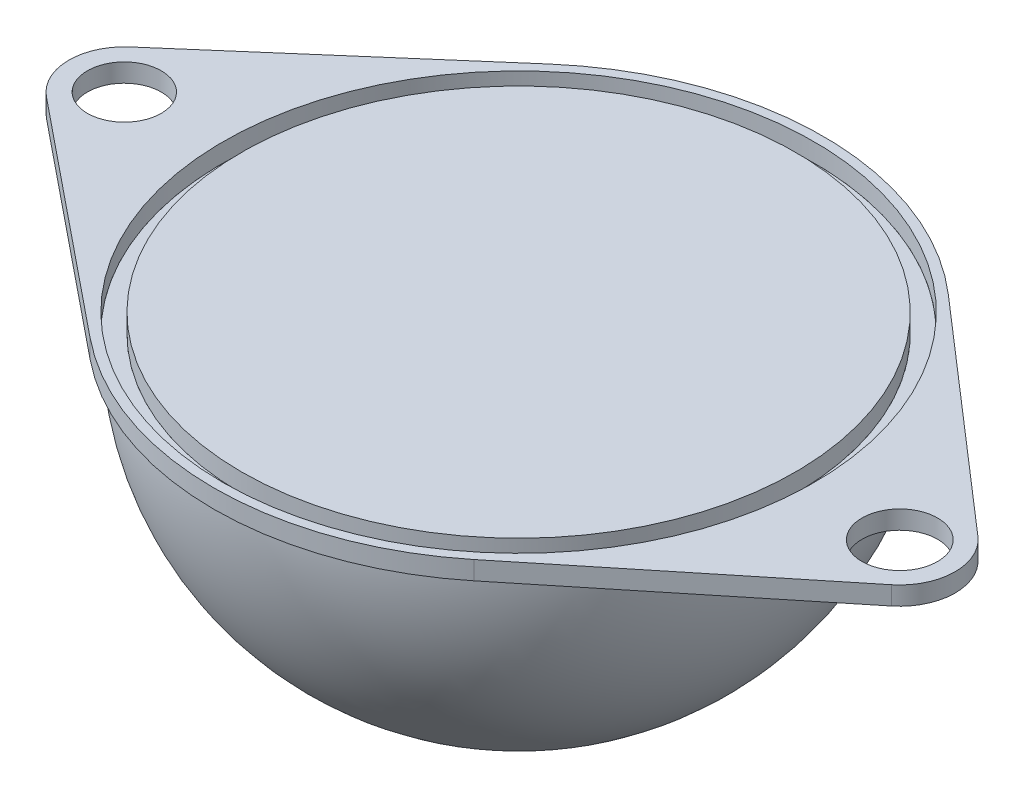
ISO-10303-21;
HEADER;
FILE_DESCRIPTION(('STEP AP214'),'2;1');
FILE_NAME('part.step','',(''),(''),'','','');
FILE_SCHEMA(('AUTOMOTIVE_DESIGN { 1 0 10303 214 1 1 1 1 }'));
ENDSEC;
DATA;
#1=APPLICATION_CONTEXT('core data for automotive mechanical design processes');
#2=APPLICATION_PROTOCOL_DEFINITION('international standard','automotive_design',2000,#1);
#3=PRODUCT_CONTEXT('',#1,'mechanical');
#4=PRODUCT('Part','Part','',(#3));
#5=PRODUCT_RELATED_PRODUCT_CATEGORY('part','',(#4));
#6=PRODUCT_DEFINITION_FORMATION('','',#4);
#7=PRODUCT_DEFINITION_CONTEXT('part definition',#1,'design');
#8=PRODUCT_DEFINITION('design','',#6,#7);
#9=PRODUCT_DEFINITION_SHAPE('','',#8);
#10=(LENGTH_UNIT() NAMED_UNIT(*) SI_UNIT(.MILLI.,.METRE.));
#11=(NAMED_UNIT(*) PLANE_ANGLE_UNIT() SI_UNIT($,.RADIAN.));
#12=(NAMED_UNIT(*) SI_UNIT($,.STERADIAN.) SOLID_ANGLE_UNIT());
#13=UNCERTAINTY_MEASURE_WITH_UNIT(LENGTH_MEASURE(1.E-05),#10,'distance_accuracy_value','');
#14=(GEOMETRIC_REPRESENTATION_CONTEXT(3) GLOBAL_UNCERTAINTY_ASSIGNED_CONTEXT((#13)) GLOBAL_UNIT_ASSIGNED_CONTEXT((#10,
#11,#12)) REPRESENTATION_CONTEXT('',''));
#15=CARTESIAN_POINT('',(0.,0.,0.));
#16=DIRECTION('',(0.,0.,1.));
#17=DIRECTION('',(1.,0.,0.));
#18=AXIS2_PLACEMENT_3D('',#15,#16,#17);
#19=CARTESIAN_POINT('',(0.,1.,0.));
#20=DIRECTION('',(0.,-1.,0.));
#21=DIRECTION('',(0.,0.,-1.));
#22=AXIS2_PLACEMENT_3D('',#19,#20,#21);
#23=CYLINDRICAL_SURFACE('',#22,15.);
#24=CARTESIAN_POINT('',(0.,1.,0.));
#25=DIRECTION('',(0.,1.,0.));
#26=DIRECTION('',(0.,0.,1.));
#27=AXIS2_PLACEMENT_3D('',#24,#25,#26);
#28=CIRCLE('',#27,15.);
#29=CARTESIAN_POINT('',(0.,1.,15.));
#30=VERTEX_POINT('',#29);
#31=EDGE_CURVE('E12',#30,#30,#28,.T.);
#32=ORIENTED_EDGE('',*,*,#31,.F.);
#33=EDGE_LOOP('',(#32));
#34=FACE_BOUND('',#33,.T.);
#35=CARTESIAN_POINT('',(0.,0.,0.));
#36=DIRECTION('',(0.,1.,0.));
#37=DIRECTION('',(0.,0.,1.));
#38=AXIS2_PLACEMENT_3D('',#35,#36,#37);
#39=CIRCLE('',#38,15.);
#40=CARTESIAN_POINT('',(0.,0.,15.));
#41=VERTEX_POINT('',#40);
#42=EDGE_CURVE('E86',#41,#41,#39,.T.);
#43=ORIENTED_EDGE('',*,*,#42,.T.);
#44=EDGE_LOOP('',(#43));
#45=FACE_BOUND('',#44,.T.);
#46=ADVANCED_FACE('F83',(#34,#45),#23,.T.);
#47=CARTESIAN_POINT('',(0.,1.,0.));
#48=DIRECTION('',(0.,1.,0.));
#49=DIRECTION('',(0.,0.,1.));
#50=AXIS2_PLACEMENT_3D('',#47,#48,#49);
#51=PLANE('',#50);
#52=ORIENTED_EDGE('',*,*,#31,.T.);
#53=EDGE_LOOP('',(#52));
#54=FACE_BOUND('',#53,.T.);
#55=ADVANCED_FACE('F98',(#54),#51,.T.);
#56=CARTESIAN_POINT('',(0.,0.,0.));
#57=DIRECTION('',(0.,1.,0.));
#58=DIRECTION('',(0.,0.,1.));
#59=AXIS2_PLACEMENT_3D('',#56,#57,#58);
#60=PLANE('',#59);
#61=ORIENTED_EDGE('',*,*,#42,.F.);
#62=EDGE_LOOP('',(#61));
#63=FACE_BOUND('',#62,.T.);
#64=ADVANCED_FACE('F96',(#63),#60,.F.);
#65=CLOSED_SHELL('',(#46,#55,#64));
#66=MANIFOLD_SOLID_BREP('B2',#65);
#67=CARTESIAN_POINT('',(10.3909072758781,1.,12.8171387596493));
#68=DIRECTION('',(0.629751956113825,0.,0.776796288463591));
#69=DIRECTION('',(0.776796288463591,0.,-0.629751956113825));
#70=AXIS2_PLACEMENT_3D('',#67,#68,#69);
#71=PLANE('',#70);
#72=DIRECTION('',(-0.776796288463591,0.,0.629751956113825));
#73=VECTOR('',#72,1.);
#74=CARTESIAN_POINT('',(10.3909072758781,0.,12.8171387596493));
#75=LINE('',#74,#73);
#76=CARTESIAN_POINT('',(22.8895238825921,0.,2.68445870737627));
#77=VERTEX_POINT('',#76);
#78=CARTESIAN_POINT('',(10.3909072758781,0.,12.8171387596493));
#79=VERTEX_POINT('',#78);
#80=EDGE_CURVE('E266',#77,#79,#75,.T.);
#81=ORIENTED_EDGE('',*,*,#80,.F.);
#82=DIRECTION('',(0.,-1.,0.));
#83=VECTOR('',#82,1.);
#84=CARTESIAN_POINT('',(22.8895238825921,1.,2.68445870737627));
#85=LINE('',#84,#83);
#86=CARTESIAN_POINT('',(22.8895238825921,1.,2.68445870737627));
#87=VERTEX_POINT('',#86);
#88=EDGE_CURVE('E81',#87,#77,#85,.T.);
#89=ORIENTED_EDGE('',*,*,#88,.F.);
#90=DIRECTION('',(-0.776796288463591,0.,0.629751956113825));
#91=VECTOR('',#90,1.);
#92=CARTESIAN_POINT('',(10.3909072758781,1.,12.8171387596493));
#93=LINE('',#92,#91);
#94=CARTESIAN_POINT('',(10.3909072758781,1.,12.8171387596493));
#95=VERTEX_POINT('',#94);
#96=EDGE_CURVE('E343',#87,#95,#93,.T.);
#97=ORIENTED_EDGE('',*,*,#96,.T.);
#98=DIRECTION('',(0.,-1.,0.));
#99=VECTOR('',#98,1.);
#100=CARTESIAN_POINT('',(10.3909072758781,1.,12.8171387596493));
#101=LINE('',#100,#99);
#102=EDGE_CURVE('E194',#95,#79,#101,.T.);
#103=ORIENTED_EDGE('',*,*,#102,.T.);
#104=EDGE_LOOP('',(#81,#89,#97,#103));
#105=FACE_BOUND('',#104,.T.);
#106=ADVANCED_FACE('F143',(#105),#71,.T.);
#107=CARTESIAN_POINT('',(21.,1.,0.353739247577881));
#108=DIRECTION('',(0.,-1.,0.));
#109=DIRECTION('',(0.,0.,-1.));
#110=AXIS2_PLACEMENT_3D('',#107,#108,#109);
#111=CYLINDRICAL_SURFACE('',#110,3.00042558700744);
#112=CARTESIAN_POINT('',(21.,0.,0.353739247577881));
#113=DIRECTION('',(0.,1.,0.));
#114=DIRECTION('',(0.,0.,1.));
#115=AXIS2_PLACEMENT_3D('',#112,#113,#114);
#116=CIRCLE('',#115,3.00042558700744);
#117=CARTESIAN_POINT('',(22.966950289829,0.,-1.91201896117064));
#118=VERTEX_POINT('',#117);
#119=EDGE_CURVE('E260',#118,#77,#116,.F.);
#120=ORIENTED_EDGE('',*,*,#119,.F.);
#121=DIRECTION('',(0.,-1.,0.));
#122=VECTOR('',#121,1.);
#123=CARTESIAN_POINT('',(22.966950289829,1.,-1.91201896117064));
#124=LINE('',#123,#122);
#125=CARTESIAN_POINT('',(22.966950289829,1.,-1.91201896117064));
#126=VERTEX_POINT('',#125);
#127=EDGE_CURVE('E152',#126,#118,#124,.T.);
#128=ORIENTED_EDGE('',*,*,#127,.F.);
#129=CARTESIAN_POINT('',(21.,1.,0.353739247577881));
#130=DIRECTION('',(0.,1.,0.));
#131=DIRECTION('',(0.,0.,1.));
#132=AXIS2_PLACEMENT_3D('',#129,#130,#131);
#133=CIRCLE('',#132,3.00042558700744);
#134=EDGE_CURVE('E345',#126,#87,#133,.F.);
#135=ORIENTED_EDGE('',*,*,#134,.T.);
#136=ORIENTED_EDGE('',*,*,#88,.T.);
#137=EDGE_LOOP('',(#120,#128,#135,#136));
#138=FACE_BOUND('',#137,.T.);
#139=ADVANCED_FACE('F265',(#138),#111,.T.);
#140=CARTESIAN_POINT('',(10.8166921128507,1.,-12.4599025572351));
#141=DIRECTION('',(-0.655557097748529,0.,0.755145609529398));
#142=DIRECTION('',(0.755145609529398,0.,0.655557097748529));
#143=AXIS2_PLACEMENT_3D('',#140,#141,#142);
#144=PLANE('',#143);
#145=DIRECTION('',(-0.755145609529398,0.,-0.655557097748529));
#146=VECTOR('',#145,1.);
#147=CARTESIAN_POINT('',(10.8166921128507,0.,-12.4599025572351));
#148=LINE('',#147,#146);
#149=CARTESIAN_POINT('',(10.8166921128507,0.,-12.4599025572351));
#150=VERTEX_POINT('',#149);
#151=EDGE_CURVE('E250',#118,#150,#148,.T.);
#152=ORIENTED_EDGE('',*,*,#151,.T.);
#153=DIRECTION('',(0.,-1.,0.));
#154=VECTOR('',#153,1.);
#155=CARTESIAN_POINT('',(10.8166921128507,1.,-12.4599025572351));
#156=LINE('',#155,#154);
#157=CARTESIAN_POINT('',(10.8166921128507,1.,-12.4599025572351));
#158=VERTEX_POINT('',#157);
#159=EDGE_CURVE('E242',#158,#150,#156,.T.);
#160=ORIENTED_EDGE('',*,*,#159,.F.);
#161=DIRECTION('',(-0.755145609529398,0.,-0.655557097748529));
#162=VECTOR('',#161,1.);
#163=CARTESIAN_POINT('',(10.8166921128507,1.,-12.4599025572351));
#164=LINE('',#163,#162);
#165=EDGE_CURVE('E252',#126,#158,#164,.T.);
#166=ORIENTED_EDGE('',*,*,#165,.F.);
#167=ORIENTED_EDGE('',*,*,#127,.T.);
#168=EDGE_LOOP('',(#152,#160,#166,#167));
#169=FACE_BOUND('',#168,.T.);
#170=ADVANCED_FACE('F248',(#169),#144,.F.);
#171=CARTESIAN_POINT('',(0.,1.,0.));
#172=DIRECTION('',(0.,-1.,0.));
#173=DIRECTION('',(0.,0.,-1.));
#174=AXIS2_PLACEMENT_3D('',#171,#172,#173);
#175=CYLINDRICAL_SURFACE('',#174,16.5);
#176=CARTESIAN_POINT('',(0.,0.,0.));
#177=DIRECTION('',(0.,1.,0.));
#178=DIRECTION('',(0.,0.,1.));
#179=AXIS2_PLACEMENT_3D('',#176,#177,#178);
#180=CIRCLE('',#179,16.5);
#181=CARTESIAN_POINT('',(-10.8166921128507,0.,-12.4599025572349));
#182=VERTEX_POINT('',#181);
#183=EDGE_CURVE('E263',#150,#182,#180,.T.);
#184=ORIENTED_EDGE('',*,*,#183,.T.);
#185=DIRECTION('',(0.,-1.,0.));
#186=VECTOR('',#185,1.);
#187=CARTESIAN_POINT('',(-10.8166921128507,1.,-12.4599025572349));
#188=LINE('',#187,#186);
#189=CARTESIAN_POINT('',(-10.8166921128507,1.,-12.4599025572349));
#190=VERTEX_POINT('',#189);
#191=EDGE_CURVE('E236',#190,#182,#188,.T.);
#192=ORIENTED_EDGE('',*,*,#191,.F.);
#193=CARTESIAN_POINT('',(0.,1.,0.));
#194=DIRECTION('',(0.,1.,0.));
#195=DIRECTION('',(0.,0.,1.));
#196=AXIS2_PLACEMENT_3D('',#193,#194,#195);
#197=CIRCLE('',#196,16.5);
#198=EDGE_CURVE('E351',#158,#190,#197,.T.);
#199=ORIENTED_EDGE('',*,*,#198,.F.);
#200=ORIENTED_EDGE('',*,*,#159,.T.);
#201=EDGE_LOOP('',(#184,#192,#199,#200));
#202=FACE_BOUND('',#201,.T.);
#203=ADVANCED_FACE('F317',(#202),#175,.T.);
#204=CARTESIAN_POINT('',(-10.8166921128507,1.,-12.4599025572349));
#205=DIRECTION('',(-0.655557097748529,0.,-0.755145609529398));
#206=DIRECTION('',(-0.755145609529398,0.,0.655557097748529));
#207=AXIS2_PLACEMENT_3D('',#204,#205,#206);
#208=PLANE('',#207);
#209=DIRECTION('',(0.755145609529398,0.,-0.655557097748529));
#210=VECTOR('',#209,1.);
#211=CARTESIAN_POINT('',(-10.8166921128507,0.,-12.4599025572349));
#212=LINE('',#211,#210);
#213=CARTESIAN_POINT('',(-22.966950289829,0.,-1.91201896117045));
#214=VERTEX_POINT('',#213);
#215=EDGE_CURVE('E273',#214,#182,#212,.T.);
#216=ORIENTED_EDGE('',*,*,#215,.F.);
#217=DIRECTION('',(0.,-1.,0.));
#218=VECTOR('',#217,1.);
#219=CARTESIAN_POINT('',(-22.966950289829,1.,-1.91201896117045));
#220=LINE('',#219,#218);
#221=CARTESIAN_POINT('',(-22.966950289829,1.,-1.91201896117045));
#222=VERTEX_POINT('',#221);
#223=EDGE_CURVE('E234',#222,#214,#220,.T.);
#224=ORIENTED_EDGE('',*,*,#223,.F.);
#225=DIRECTION('',(0.755145609529398,0.,-0.655557097748529));
#226=VECTOR('',#225,1.);
#227=CARTESIAN_POINT('',(-10.8166921128507,1.,-12.4599025572349));
#228=LINE('',#227,#226);
#229=EDGE_CURVE('E228',#222,#190,#228,.T.);
#230=ORIENTED_EDGE('',*,*,#229,.T.);
#231=ORIENTED_EDGE('',*,*,#191,.T.);
#232=EDGE_LOOP('',(#216,#224,#230,#231));
#233=FACE_BOUND('',#232,.T.);
#234=ADVANCED_FACE('F320',(#233),#208,.T.);
#235=CARTESIAN_POINT('',(-21.,1.,0.3537392475777));
#236=DIRECTION('',(0.,-1.,0.));
#237=DIRECTION('',(0.,0.,-1.));
#238=AXIS2_PLACEMENT_3D('',#235,#236,#237);
#239=CYLINDRICAL_SURFACE('',#238,3.00042558700744);
#240=CARTESIAN_POINT('',(-21.,0.,0.3537392475777));
#241=DIRECTION('',(0.,1.,0.));
#242=DIRECTION('',(0.,0.,1.));
#243=AXIS2_PLACEMENT_3D('',#240,#241,#242);
#244=CIRCLE('',#243,3.00042558700744);
#245=CARTESIAN_POINT('',(-22.8895238825917,0.,2.68445870737646));
#246=VERTEX_POINT('',#245);
#247=EDGE_CURVE('E233',#214,#246,#244,.T.);
#248=ORIENTED_EDGE('',*,*,#247,.T.);
#249=DIRECTION('',(0.,-1.,0.));
#250=VECTOR('',#249,1.);
#251=CARTESIAN_POINT('',(-22.8895238825917,1.,2.68445870737646));
#252=LINE('',#251,#250);
#253=CARTESIAN_POINT('',(-22.8895238825917,1.,2.68445870737646));
#254=VERTEX_POINT('',#253);
#255=EDGE_CURVE('E218',#254,#246,#252,.T.);
#256=ORIENTED_EDGE('',*,*,#255,.F.);
#257=CARTESIAN_POINT('',(-21.,1.,0.3537392475777));
#258=DIRECTION('',(0.,1.,0.));
#259=DIRECTION('',(0.,0.,1.));
#260=AXIS2_PLACEMENT_3D('',#257,#258,#259);
#261=CIRCLE('',#260,3.00042558700744);
#262=EDGE_CURVE('E221',#222,#254,#261,.T.);
#263=ORIENTED_EDGE('',*,*,#262,.F.);
#264=ORIENTED_EDGE('',*,*,#223,.T.);
#265=EDGE_LOOP('',(#248,#256,#263,#264));
#266=FACE_BOUND('',#265,.T.);
#267=ADVANCED_FACE('F231',(#266),#239,.T.);
#268=CARTESIAN_POINT('',(-10.3909072758781,1.,12.8171387596495));
#269=DIRECTION('',(0.629751956113825,0.,-0.776796288463591));
#270=DIRECTION('',(-0.776796288463591,0.,-0.629751956113825));
#271=AXIS2_PLACEMENT_3D('',#268,#269,#270);
#272=PLANE('',#271);
#273=DIRECTION('',(0.776796288463591,0.,0.629751956113825));
#274=VECTOR('',#273,1.);
#275=CARTESIAN_POINT('',(-10.3909072758781,0.,12.8171387596495));
#276=LINE('',#275,#274);
#277=CARTESIAN_POINT('',(-10.3909072758781,0.,12.8171387596495));
#278=VERTEX_POINT('',#277);
#279=EDGE_CURVE('E276',#246,#278,#276,.T.);
#280=ORIENTED_EDGE('',*,*,#279,.T.);
#281=DIRECTION('',(0.,-1.,0.));
#282=VECTOR('',#281,1.);
#283=CARTESIAN_POINT('',(-10.3909072758781,1.,12.8171387596495));
#284=LINE('',#283,#282);
#285=CARTESIAN_POINT('',(-10.3909072758781,1.,12.8171387596495));
#286=VERTEX_POINT('',#285);
#287=EDGE_CURVE('E220',#286,#278,#284,.T.);
#288=ORIENTED_EDGE('',*,*,#287,.F.);
#289=DIRECTION('',(0.776796288463591,0.,0.629751956113825));
#290=VECTOR('',#289,1.);
#291=CARTESIAN_POINT('',(-10.3909072758781,1.,12.8171387596495));
#292=LINE('',#291,#290);
#293=EDGE_CURVE('E213',#254,#286,#292,.T.);
#294=ORIENTED_EDGE('',*,*,#293,.F.);
#295=ORIENTED_EDGE('',*,*,#255,.T.);
#296=EDGE_LOOP('',(#280,#288,#294,#295));
#297=FACE_BOUND('',#296,.T.);
#298=ADVANCED_FACE('F216',(#297),#272,.F.);
#299=CARTESIAN_POINT('',(0.,1.,0.));
#300=DIRECTION('',(0.,-1.,0.));
#301=DIRECTION('',(0.,0.,-1.));
#302=AXIS2_PLACEMENT_3D('',#299,#300,#301);
#303=CYLINDRICAL_SURFACE('',#302,16.5);
#304=CARTESIAN_POINT('',(0.,0.,0.));
#305=DIRECTION('',(0.,1.,0.));
#306=DIRECTION('',(0.,0.,1.));
#307=AXIS2_PLACEMENT_3D('',#304,#305,#306);
#308=CIRCLE('',#307,16.5);
#309=EDGE_CURVE('E187',#278,#79,#308,.T.);
#310=ORIENTED_EDGE('',*,*,#309,.T.);
#311=ORIENTED_EDGE('',*,*,#102,.F.);
#312=CARTESIAN_POINT('',(0.,1.,0.));
#313=DIRECTION('',(0.,1.,0.));
#314=DIRECTION('',(0.,0.,1.));
#315=AXIS2_PLACEMENT_3D('',#312,#313,#314);
#316=CIRCLE('',#315,16.5);
#317=EDGE_CURVE('E160',#286,#95,#316,.T.);
#318=ORIENTED_EDGE('',*,*,#317,.F.);
#319=ORIENTED_EDGE('',*,*,#287,.T.);
#320=EDGE_LOOP('',(#310,#311,#318,#319));
#321=FACE_BOUND('',#320,.T.);
#322=ADVANCED_FACE('F297',(#321),#303,.T.);
#323=CARTESIAN_POINT('',(21.,1.,0.353739247577881));
#324=DIRECTION('',(0.,-1.,0.));
#325=DIRECTION('',(0.,0.,-1.));
#326=AXIS2_PLACEMENT_3D('',#323,#324,#325);
#327=CYLINDRICAL_SURFACE('',#326,2.04612011291577);
#328=CARTESIAN_POINT('',(21.,1.,0.353739247577881));
#329=DIRECTION('',(0.,1.,0.));
#330=DIRECTION('',(0.,0.,1.));
#331=AXIS2_PLACEMENT_3D('',#328,#329,#330);
#332=CIRCLE('',#331,2.04612011291577);
#333=CARTESIAN_POINT('',(21.,1.,2.39985936049365));
#334=VERTEX_POINT('',#333);
#335=EDGE_CURVE('E342',#334,#334,#332,.T.);
#336=ORIENTED_EDGE('',*,*,#335,.T.);
#337=EDGE_LOOP('',(#336));
#338=FACE_BOUND('',#337,.T.);
#339=CARTESIAN_POINT('',(21.,0.,0.353739247577881));
#340=DIRECTION('',(0.,1.,0.));
#341=DIRECTION('',(0.,0.,1.));
#342=AXIS2_PLACEMENT_3D('',#339,#340,#341);
#343=CIRCLE('',#342,2.04612011291577);
#344=CARTESIAN_POINT('',(21.,0.,2.39985936049365));
#345=VERTEX_POINT('',#344);
#346=EDGE_CURVE('E268',#345,#345,#343,.T.);
#347=ORIENTED_EDGE('',*,*,#346,.F.);
#348=EDGE_LOOP('',(#347));
#349=FACE_BOUND('',#348,.T.);
#350=ADVANCED_FACE('F295',(#338,#349),#327,.F.);
#351=CARTESIAN_POINT('',(0.,1.,0.));
#352=DIRECTION('',(0.,-1.,0.));
#353=DIRECTION('',(0.,0.,-1.));
#354=AXIS2_PLACEMENT_3D('',#351,#352,#353);
#355=CYLINDRICAL_SURFACE('',#354,16.);
#356=CARTESIAN_POINT('',(0.,1.,0.));
#357=DIRECTION('',(0.,1.,0.));
#358=DIRECTION('',(0.,0.,1.));
#359=AXIS2_PLACEMENT_3D('',#356,#357,#358);
#360=CIRCLE('',#359,16.);
#361=CARTESIAN_POINT('',(0.,1.,16.));
#362=VERTEX_POINT('',#361);
#363=EDGE_CURVE('E281',#362,#362,#360,.T.);
#364=ORIENTED_EDGE('',*,*,#363,.T.);
#365=EDGE_LOOP('',(#364));
#366=FACE_BOUND('',#365,.T.);
#367=CARTESIAN_POINT('',(0.,0.,0.));
#368=DIRECTION('',(0.,1.,0.));
#369=DIRECTION('',(0.,0.,1.));
#370=AXIS2_PLACEMENT_3D('',#367,#368,#369);
#371=CIRCLE('',#370,16.);
#372=CARTESIAN_POINT('',(0.,0.,16.));
#373=VERTEX_POINT('',#372);
#374=EDGE_CURVE('E289',#373,#373,#371,.T.);
#375=ORIENTED_EDGE('',*,*,#374,.F.);
#376=EDGE_LOOP('',(#375));
#377=FACE_BOUND('',#376,.T.);
#378=ADVANCED_FACE('F145',(#366,#377),#355,.F.);
#379=CARTESIAN_POINT('',(-21.,1.,0.3537392475777));
#380=DIRECTION('',(0.,-1.,0.));
#381=DIRECTION('',(0.,0.,-1.));
#382=AXIS2_PLACEMENT_3D('',#379,#380,#381);
#383=CYLINDRICAL_SURFACE('',#382,2.);
#384=CARTESIAN_POINT('',(-21.,1.,0.3537392475777));
#385=DIRECTION('',(0.,1.,0.));
#386=DIRECTION('',(0.,0.,1.));
#387=AXIS2_PLACEMENT_3D('',#384,#385,#386);
#388=CIRCLE('',#387,2.);
#389=CARTESIAN_POINT('',(-21.,1.,2.3537392475777));
#390=VERTEX_POINT('',#389);
#391=EDGE_CURVE('E282',#390,#390,#388,.T.);
#392=ORIENTED_EDGE('',*,*,#391,.T.);
#393=EDGE_LOOP('',(#392));
#394=FACE_BOUND('',#393,.T.);
#395=CARTESIAN_POINT('',(-21.,0.,0.3537392475777));
#396=DIRECTION('',(0.,1.,0.));
#397=DIRECTION('',(0.,0.,1.));
#398=AXIS2_PLACEMENT_3D('',#395,#396,#397);
#399=CIRCLE('',#398,2.);
#400=CARTESIAN_POINT('',(-21.,0.,2.3537392475777));
#401=VERTEX_POINT('',#400);
#402=EDGE_CURVE('E279',#401,#401,#399,.T.);
#403=ORIENTED_EDGE('',*,*,#402,.F.);
#404=EDGE_LOOP('',(#403));
#405=FACE_BOUND('',#404,.T.);
#406=ADVANCED_FACE('F303',(#394,#405),#383,.F.);
#407=CARTESIAN_POINT('',(0.,1.,0.));
#408=DIRECTION('',(0.,1.,0.));
#409=DIRECTION('',(0.,0.,1.));
#410=AXIS2_PLACEMENT_3D('',#407,#408,#409);
#411=PLANE('',#410);
#412=ORIENTED_EDGE('',*,*,#363,.F.);
#413=EDGE_LOOP('',(#412));
#414=FACE_BOUND('',#413,.T.);
#415=ORIENTED_EDGE('',*,*,#335,.F.);
#416=EDGE_LOOP('',(#415));
#417=FACE_BOUND('',#416,.T.);
#418=ORIENTED_EDGE('',*,*,#96,.F.);
#419=ORIENTED_EDGE('',*,*,#134,.F.);
#420=ORIENTED_EDGE('',*,*,#165,.T.);
#421=ORIENTED_EDGE('',*,*,#198,.T.);
#422=ORIENTED_EDGE('',*,*,#229,.F.);
#423=ORIENTED_EDGE('',*,*,#262,.T.);
#424=ORIENTED_EDGE('',*,*,#293,.T.);
#425=ORIENTED_EDGE('',*,*,#317,.T.);
#426=EDGE_LOOP('',(#418,#419,#420,#421,#422,#423,#424,#425));
#427=FACE_BOUND('',#426,.T.);
#428=ORIENTED_EDGE('',*,*,#391,.F.);
#429=EDGE_LOOP('',(#428));
#430=FACE_BOUND('',#429,.T.);
#431=ADVANCED_FACE('F225',(#414,#417,#427,#430),#411,.T.);
#432=CARTESIAN_POINT('',(0.,0.,0.));
#433=DIRECTION('',(0.,1.,0.));
#434=DIRECTION('',(0.,0.,1.));
#435=AXIS2_PLACEMENT_3D('',#432,#433,#434);
#436=PLANE('',#435);
#437=ORIENTED_EDGE('',*,*,#374,.T.);
#438=EDGE_LOOP('',(#437));
#439=FACE_BOUND('',#438,.T.);
#440=ORIENTED_EDGE('',*,*,#346,.T.);
#441=EDGE_LOOP('',(#440));
#442=FACE_BOUND('',#441,.T.);
#443=ORIENTED_EDGE('',*,*,#80,.T.);
#444=ORIENTED_EDGE('',*,*,#309,.F.);
#445=ORIENTED_EDGE('',*,*,#279,.F.);
#446=ORIENTED_EDGE('',*,*,#247,.F.);
#447=ORIENTED_EDGE('',*,*,#215,.T.);
#448=ORIENTED_EDGE('',*,*,#183,.F.);
#449=ORIENTED_EDGE('',*,*,#151,.F.);
#450=ORIENTED_EDGE('',*,*,#119,.T.);
#451=EDGE_LOOP('',(#443,#444,#445,#446,#447,#448,#449,#450));
#452=FACE_BOUND('',#451,.T.);
#453=ORIENTED_EDGE('',*,*,#402,.T.);
#454=EDGE_LOOP('',(#453));
#455=FACE_BOUND('',#454,.T.);
#456=ADVANCED_FACE('F258',(#439,#442,#452,#455),#436,.F.);
#457=CLOSED_SHELL('',(#106,#139,#170,#203,#234,#267,#298,#322,#350,#378,#406,#431,#456));
#458=MANIFOLD_SOLID_BREP('B7',#457);
#459=CARTESIAN_POINT('',(0.,0.,0.));
#460=DIRECTION('',(-1.,0.,0.));
#461=DIRECTION('',(0.,0.,1.));
#462=AXIS2_PLACEMENT_3D('',#459,#460,#461);
#463=SPHERICAL_SURFACE('',#462,16.);
#464=CARTESIAN_POINT('',(0.,0.,0.));
#465=DIRECTION('',(0.,1.,0.));
#466=DIRECTION('',(0.,0.,1.));
#467=AXIS2_PLACEMENT_3D('',#464,#465,#466);
#468=SPHERICAL_SURFACE('',#467,16.);
#469=CARTESIAN_POINT('',(0.,-14.1332940251026,0.));
#470=DIRECTION('',(0.,1.,0.));
#471=DIRECTION('',(0.,0.,1.));
#472=AXIS2_PLACEMENT_3D('',#469,#470,#471);
#473=CIRCLE('',#472,7.5);
#474=CARTESIAN_POINT('',(0.,-14.1332940251026,7.5));
#475=VERTEX_POINT('',#474);
#476=EDGE_CURVE('E447',#475,#475,#473,.T.);
#477=ORIENTED_EDGE('',*,*,#476,.T.);
#478=EDGE_LOOP('',(#477));
#479=FACE_BOUND('',#478,.T.);
#480=CARTESIAN_POINT('',(0.,0.,0.));
#481=DIRECTION('',(0.,-1.,0.));
#482=DIRECTION('',(0.,0.,-1.));
#483=AXIS2_PLACEMENT_3D('',#480,#481,#482);
#484=CIRCLE('',#483,16.);
#485=CARTESIAN_POINT('',(0.,1.1172740284298E-13,-16.));
#486=VERTEX_POINT('',#485);
#487=EDGE_CURVE('E441',#486,#486,#484,.T.);
#488=ORIENTED_EDGE('',*,*,#487,.T.);
#489=EDGE_LOOP('',(#488));
#490=FACE_BOUND('',#489,.T.);
#491=ADVANCED_FACE('F434',(#479,#490),#468,.T.);
#492=CARTESIAN_POINT('',(0.,0.,0.));
#493=DIRECTION('',(-1.,0.,0.));
#494=DIRECTION('',(0.,0.,1.));
#495=AXIS2_PLACEMENT_3D('',#492,#493,#494);
#496=SPHERICAL_SURFACE('',#495,15.);
#497=CARTESIAN_POINT('',(0.,0.,0.));
#498=DIRECTION('',(0.,1.,0.));
#499=DIRECTION('',(0.,0.,1.));
#500=AXIS2_PLACEMENT_3D('',#497,#498,#499);
#501=SPHERICAL_SURFACE('',#500,15.);
#502=CARTESIAN_POINT('',(0.,-12.9903810567666,0.));
#503=DIRECTION('',(0.,1.,0.));
#504=DIRECTION('',(0.,0.,1.));
#505=AXIS2_PLACEMENT_3D('',#502,#503,#504);
#506=CIRCLE('',#505,7.5);
#507=CARTESIAN_POINT('',(0.,-12.9903810567666,7.5));
#508=VERTEX_POINT('',#507);
#509=EDGE_CURVE('E437',#508,#508,#506,.F.);
#510=ORIENTED_EDGE('',*,*,#509,.T.);
#511=EDGE_LOOP('',(#510));
#512=FACE_BOUND('',#511,.T.);
#513=CARTESIAN_POINT('',(0.,0.,0.));
#514=DIRECTION('',(0.,-1.,0.));
#515=DIRECTION('',(0.,0.,-1.));
#516=AXIS2_PLACEMENT_3D('',#513,#514,#515);
#517=CIRCLE('',#516,15.);
#518=CARTESIAN_POINT('',(0.,1.04744440165294E-13,-15.));
#519=VERTEX_POINT('',#518);
#520=EDGE_CURVE('E142',#519,#519,#517,.T.);
#521=ORIENTED_EDGE('',*,*,#520,.F.);
#522=EDGE_LOOP('',(#521));
#523=FACE_BOUND('',#522,.T.);
#524=ADVANCED_FACE('F454',(#512,#523),#501,.F.);
#525=CARTESIAN_POINT('',(0.,0.,0.));
#526=DIRECTION('',(0.,-1.,0.));
#527=DIRECTION('',(0.,0.,-1.));
#528=AXIS2_PLACEMENT_3D('',#525,#526,#527);
#529=PLANE('',#528);
#530=ORIENTED_EDGE('',*,*,#520,.T.);
#531=EDGE_LOOP('',(#530));
#532=FACE_BOUND('',#531,.T.);
#533=ORIENTED_EDGE('',*,*,#487,.F.);
#534=EDGE_LOOP('',(#533));
#535=FACE_BOUND('',#534,.T.);
#536=ADVANCED_FACE('F459',(#532,#535),#529,.F.);
#537=CARTESIAN_POINT('',(0.,-16.001,0.));
#538=DIRECTION('',(0.,1.,0.));
#539=DIRECTION('',(0.,0.,1.));
#540=AXIS2_PLACEMENT_3D('',#537,#538,#539);
#541=CYLINDRICAL_SURFACE('',#540,7.5);
#542=ORIENTED_EDGE('',*,*,#476,.F.);
#543=EDGE_LOOP('',(#542));
#544=FACE_BOUND('',#543,.T.);
#545=ORIENTED_EDGE('',*,*,#509,.F.);
#546=EDGE_LOOP('',(#545));
#547=FACE_BOUND('',#546,.T.);
#548=ADVANCED_FACE('F457',(#544,#547),#541,.F.);
#549=CLOSED_SHELL('',(#491,#524,#536,#548));
#550=MANIFOLD_SOLID_BREP('B75',#549);
#551=ADVANCED_BREP_SHAPE_REPRESENTATION('',(#18,#66,#458,#550),#14);
#552=SHAPE_DEFINITION_REPRESENTATION(#9,#551);
ENDSEC;
END-ISO-10303-21;
